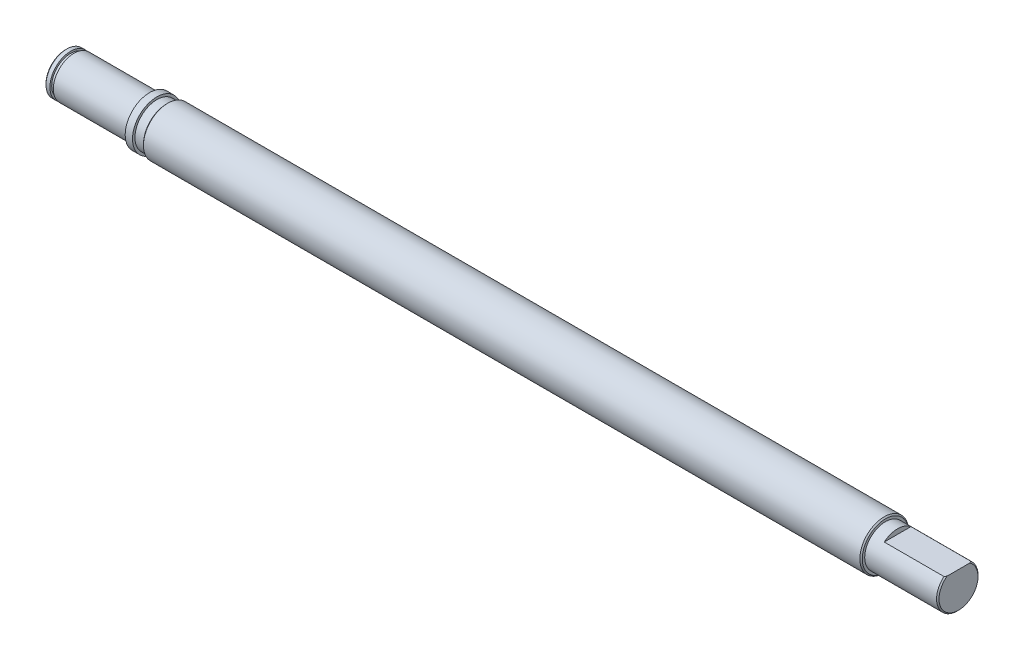
ISO-10303-21;
HEADER;
FILE_DESCRIPTION(('STEP AP214'),'2;1');
FILE_NAME('part.step','',(''),(''),'','','');
FILE_SCHEMA(('AUTOMOTIVE_DESIGN { 1 0 10303 214 1 1 1 1 }'));
ENDSEC;
DATA;
#1=APPLICATION_CONTEXT('core data for automotive mechanical design processes');
#2=APPLICATION_PROTOCOL_DEFINITION('international standard','automotive_design',2000,#1);
#3=PRODUCT_CONTEXT('',#1,'mechanical');
#4=PRODUCT('Part','Part','',(#3));
#5=PRODUCT_RELATED_PRODUCT_CATEGORY('part','',(#4));
#6=PRODUCT_DEFINITION_FORMATION('','',#4);
#7=PRODUCT_DEFINITION_CONTEXT('part definition',#1,'design');
#8=PRODUCT_DEFINITION('design','',#6,#7);
#9=PRODUCT_DEFINITION_SHAPE('','',#8);
#10=(LENGTH_UNIT() NAMED_UNIT(*) SI_UNIT(.MILLI.,.METRE.));
#11=(NAMED_UNIT(*) PLANE_ANGLE_UNIT() SI_UNIT($,.RADIAN.));
#12=(NAMED_UNIT(*) SI_UNIT($,.STERADIAN.) SOLID_ANGLE_UNIT());
#13=UNCERTAINTY_MEASURE_WITH_UNIT(LENGTH_MEASURE(1.E-05),#10,'distance_accuracy_value','');
#14=(GEOMETRIC_REPRESENTATION_CONTEXT(3) GLOBAL_UNCERTAINTY_ASSIGNED_CONTEXT((#13)) GLOBAL_UNIT_ASSIGNED_CONTEXT((#10,
#11,#12)) REPRESENTATION_CONTEXT('',''));
#15=CARTESIAN_POINT('',(0.,0.,0.));
#16=DIRECTION('',(0.,0.,1.));
#17=DIRECTION('',(1.,0.,0.));
#18=AXIS2_PLACEMENT_3D('',#15,#16,#17);
#19=CARTESIAN_POINT('',(-850.209513437538,-2.22044604925031E-13,-1.11022302462516E-13));
#20=DIRECTION('',(-1.,0.,0.));
#21=DIRECTION('',(0.,0.,1.));
#22=AXIS2_PLACEMENT_3D('',#19,#20,#21);
#23=CYLINDRICAL_SURFACE('',#22,10.);
#24=CARTESIAN_POINT('',(-331.998327754521,0.,0.));
#25=DIRECTION('',(-1.,0.,0.));
#26=DIRECTION('',(0.,0.,1.));
#27=AXIS2_PLACEMENT_3D('',#24,#25,#26);
#28=CIRCLE('',#27,10.);
#29=CARTESIAN_POINT('',(-331.998327754521,0.,10.));
#30=VERTEX_POINT('',#29);
#31=EDGE_CURVE('E135',#30,#30,#28,.T.);
#32=ORIENTED_EDGE('',*,*,#31,.F.);
#33=EDGE_LOOP('',(#32));
#34=FACE_BOUND('',#33,.T.);
#35=CARTESIAN_POINT('',(-328.998327754521,0.,0.));
#36=DIRECTION('',(-1.,0.,0.));
#37=DIRECTION('',(0.,0.,1.));
#38=AXIS2_PLACEMENT_3D('',#35,#36,#37);
#39=CIRCLE('',#38,10.);
#40=CARTESIAN_POINT('',(-328.998327754521,0.,10.));
#41=VERTEX_POINT('',#40);
#42=EDGE_CURVE('E105',#41,#41,#39,.T.);
#43=ORIENTED_EDGE('',*,*,#42,.T.);
#44=EDGE_LOOP('',(#43));
#45=FACE_BOUND('',#44,.T.);
#46=ADVANCED_FACE('F50',(#34,#45),#23,.T.);
#47=CARTESIAN_POINT('',(-331.998327754521,-10.,1.11022302462516E-13));
#48=DIRECTION('',(1.,0.,0.));
#49=DIRECTION('',(0.,0.,-1.));
#50=AXIS2_PLACEMENT_3D('',#47,#48,#49);
#51=PLANE('',#50);
#52=CARTESIAN_POINT('',(-331.998327754521,0.,0.));
#53=DIRECTION('',(-1.,0.,0.));
#54=DIRECTION('',(0.,0.,1.));
#55=AXIS2_PLACEMENT_3D('',#52,#53,#54);
#56=CIRCLE('',#55,8.5);
#57=CARTESIAN_POINT('',(-331.998327754521,0.,8.5));
#58=VERTEX_POINT('',#57);
#59=EDGE_CURVE('E132',#58,#58,#56,.T.);
#60=ORIENTED_EDGE('',*,*,#59,.F.);
#61=EDGE_LOOP('',(#60));
#62=FACE_BOUND('',#61,.T.);
#63=ORIENTED_EDGE('',*,*,#31,.T.);
#64=EDGE_LOOP('',(#63));
#65=FACE_BOUND('',#64,.T.);
#66=ADVANCED_FACE('F171',(#62,#65),#51,.F.);
#67=CARTESIAN_POINT('',(-850.209513437538,-2.22044604925031E-13,-1.11022302462516E-13));
#68=DIRECTION('',(-1.,0.,0.));
#69=DIRECTION('',(0.,0.,1.));
#70=AXIS2_PLACEMENT_3D('',#67,#68,#69);
#71=CYLINDRICAL_SURFACE('',#70,8.5);
#72=CARTESIAN_POINT('',(-362.998327754521,0.,0.));
#73=DIRECTION('',(-1.,0.,0.));
#74=DIRECTION('',(0.,0.,1.));
#75=AXIS2_PLACEMENT_3D('',#72,#73,#74);
#76=CIRCLE('',#75,8.5);
#77=CARTESIAN_POINT('',(-362.998327754521,0.,8.5));
#78=VERTEX_POINT('',#77);
#79=EDGE_CURVE('E129',#78,#78,#76,.T.);
#80=ORIENTED_EDGE('',*,*,#79,.F.);
#81=EDGE_LOOP('',(#80));
#82=FACE_BOUND('',#81,.T.);
#83=ORIENTED_EDGE('',*,*,#59,.T.);
#84=EDGE_LOOP('',(#83));
#85=FACE_BOUND('',#84,.T.);
#86=ADVANCED_FACE('F177',(#82,#85),#71,.T.);
#87=CARTESIAN_POINT('',(-362.998327754521,-7.75000000000003,0.));
#88=DIRECTION('',(1.,0.,0.));
#89=DIRECTION('',(0.,0.,-1.));
#90=AXIS2_PLACEMENT_3D('',#87,#88,#89);
#91=PLANE('',#90);
#92=CARTESIAN_POINT('',(-362.998327754521,0.,0.));
#93=DIRECTION('',(-1.,0.,0.));
#94=DIRECTION('',(0.,0.,1.));
#95=AXIS2_PLACEMENT_3D('',#92,#93,#94);
#96=CIRCLE('',#95,7.75);
#97=CARTESIAN_POINT('',(-362.998327754521,0.,7.75));
#98=VERTEX_POINT('',#97);
#99=EDGE_CURVE('E126',#98,#98,#96,.T.);
#100=ORIENTED_EDGE('',*,*,#99,.F.);
#101=EDGE_LOOP('',(#100));
#102=FACE_BOUND('',#101,.T.);
#103=ORIENTED_EDGE('',*,*,#79,.T.);
#104=EDGE_LOOP('',(#103));
#105=FACE_BOUND('',#104,.T.);
#106=ADVANCED_FACE('F217',(#102,#105),#91,.F.);
#107=CARTESIAN_POINT('',(-850.209513437538,-2.22044604925031E-13,-1.11022302462516E-13));
#108=DIRECTION('',(-1.,0.,0.));
#109=DIRECTION('',(0.,0.,1.));
#110=AXIS2_PLACEMENT_3D('',#107,#108,#109);
#111=CYLINDRICAL_SURFACE('',#110,7.75);
#112=CARTESIAN_POINT('',(-364.398327754521,0.,0.));
#113=DIRECTION('',(-1.,0.,0.));
#114=DIRECTION('',(0.,0.,1.));
#115=AXIS2_PLACEMENT_3D('',#112,#113,#114);
#116=CIRCLE('',#115,7.75);
#117=CARTESIAN_POINT('',(-364.398327754521,0.,7.75));
#118=VERTEX_POINT('',#117);
#119=EDGE_CURVE('E123',#118,#118,#116,.T.);
#120=ORIENTED_EDGE('',*,*,#119,.F.);
#121=EDGE_LOOP('',(#120));
#122=FACE_BOUND('',#121,.T.);
#123=ORIENTED_EDGE('',*,*,#99,.T.);
#124=EDGE_LOOP('',(#123));
#125=FACE_BOUND('',#124,.T.);
#126=ADVANCED_FACE('F213',(#122,#125),#111,.T.);
#127=CARTESIAN_POINT('',(-364.398327754521,-8.50000000000006,0.));
#128=DIRECTION('',(-1.,0.,0.));
#129=DIRECTION('',(0.,0.,1.));
#130=AXIS2_PLACEMENT_3D('',#127,#128,#129);
#131=PLANE('',#130);
#132=CARTESIAN_POINT('',(-364.398327754521,0.,0.));
#133=DIRECTION('',(-1.,0.,0.));
#134=DIRECTION('',(0.,0.,1.));
#135=AXIS2_PLACEMENT_3D('',#132,#133,#134);
#136=CIRCLE('',#135,8.5);
#137=CARTESIAN_POINT('',(-364.398327754521,0.,8.5));
#138=VERTEX_POINT('',#137);
#139=EDGE_CURVE('E120',#138,#138,#136,.T.);
#140=ORIENTED_EDGE('',*,*,#139,.F.);
#141=EDGE_LOOP('',(#140));
#142=FACE_BOUND('',#141,.T.);
#143=ORIENTED_EDGE('',*,*,#119,.T.);
#144=EDGE_LOOP('',(#143));
#145=FACE_BOUND('',#144,.T.);
#146=ADVANCED_FACE('F206',(#142,#145),#131,.F.);
#147=CARTESIAN_POINT('',(-850.209513437538,-2.22044604925031E-13,-1.11022302462516E-13));
#148=DIRECTION('',(-1.,0.,0.));
#149=DIRECTION('',(0.,0.,1.));
#150=AXIS2_PLACEMENT_3D('',#147,#148,#149);
#151=CYLINDRICAL_SURFACE('',#150,8.49999999999999);
#152=CARTESIAN_POINT('',(-365.998327754521,0.,0.));
#153=DIRECTION('',(1.,0.,0.));
#154=DIRECTION('',(0.,0.,-1.));
#155=AXIS2_PLACEMENT_3D('',#152,#153,#154);
#156=CIRCLE('',#155,8.49999999999999);
#157=CARTESIAN_POINT('',(-365.998327754521,0.,-8.49999999999999));
#158=VERTEX_POINT('',#157);
#159=EDGE_CURVE('E150',#158,#158,#156,.T.);
#160=ORIENTED_EDGE('',*,*,#159,.T.);
#161=EDGE_LOOP('',(#160));
#162=FACE_BOUND('',#161,.T.);
#163=ORIENTED_EDGE('',*,*,#139,.T.);
#164=EDGE_LOOP('',(#163));
#165=FACE_BOUND('',#164,.T.);
#166=ADVANCED_FACE('F199',(#162,#165),#151,.T.);
#167=CARTESIAN_POINT('',(-366.498327754521,-8.50000000000006,0.));
#168=DIRECTION('',(1.,0.,0.));
#169=DIRECTION('',(0.,0.,-1.));
#170=AXIS2_PLACEMENT_3D('',#167,#168,#169);
#171=PLANE('',#170);
#172=CARTESIAN_POINT('',(-366.498327754521,0.,0.));
#173=DIRECTION('',(1.,0.,0.));
#174=DIRECTION('',(0.,0.,-1.));
#175=AXIS2_PLACEMENT_3D('',#172,#173,#174);
#176=CIRCLE('',#175,8.00000000000006);
#177=CARTESIAN_POINT('',(-366.498327754521,0.,-8.00000000000006));
#178=VERTEX_POINT('',#177);
#179=EDGE_CURVE('E147',#178,#178,#176,.F.);
#180=ORIENTED_EDGE('',*,*,#179,.T.);
#181=EDGE_LOOP('',(#180));
#182=FACE_BOUND('',#181,.T.);
#183=ADVANCED_FACE('F197',(#182),#171,.F.);
#184=CARTESIAN_POINT('',(0.,0.,0.));
#185=DIRECTION('',(-1.,0.,0.));
#186=DIRECTION('',(0.,0.,1.));
#187=AXIS2_PLACEMENT_3D('',#184,#185,#186);
#188=PLANE('',#187);
#189=CARTESIAN_POINT('',(0.,0.,0.));
#190=DIRECTION('',(-1.,0.,0.));
#191=DIRECTION('',(0.,0.,1.));
#192=AXIS2_PLACEMENT_3D('',#189,#190,#191);
#193=CIRCLE('',#192,8.00000000000001);
#194=CARTESIAN_POINT('',(0.,6.49999999999984,4.66368952654433));
#195=VERTEX_POINT('',#194);
#196=CARTESIAN_POINT('',(0.,6.50000000000006,-4.66368952654456));
#197=VERTEX_POINT('',#196);
#198=EDGE_CURVE('E156',#195,#197,#193,.F.);
#199=ORIENTED_EDGE('',*,*,#198,.T.);
#200=DIRECTION('',(0.,0.,-1.));
#201=VECTOR('',#200,1.);
#202=CARTESIAN_POINT('',(0.,6.50000000000006,5.47722557505159));
#203=LINE('',#202,#201);
#204=EDGE_CURVE('E70',#195,#197,#203,.T.);
#205=ORIENTED_EDGE('',*,*,#204,.F.);
#206=EDGE_LOOP('',(#199,#205));
#207=FACE_BOUND('',#206,.T.);
#208=ADVANCED_FACE('F160',(#207),#188,.F.);
#209=CARTESIAN_POINT('',(-850.209513437538,-2.22044604925031E-13,-1.11022302462516E-13));
#210=DIRECTION('',(-1.,0.,0.));
#211=DIRECTION('',(0.,0.,1.));
#212=AXIS2_PLACEMENT_3D('',#209,#210,#211);
#213=CYLINDRICAL_SURFACE('',#212,8.5);
#214=CARTESIAN_POINT('',(-0.500000000000056,0.,0.));
#215=DIRECTION('',(-1.,0.,0.));
#216=DIRECTION('',(0.,0.,1.));
#217=AXIS2_PLACEMENT_3D('',#214,#215,#216);
#218=CIRCLE('',#217,8.5);
#219=CARTESIAN_POINT('',(-0.499999999999834,6.49999999999984,-5.4772255750517));
#220=VERTEX_POINT('',#219);
#221=CARTESIAN_POINT('',(-0.500000000000056,6.50000000000006,5.47722557505159));
#222=VERTEX_POINT('',#221);
#223=EDGE_CURVE('E103',#220,#222,#218,.T.);
#224=ORIENTED_EDGE('',*,*,#223,.T.);
#225=DIRECTION('',(1.,0.,0.));
#226=VECTOR('',#225,1.);
#227=CARTESIAN_POINT('',(-24.9999999999999,6.50000000000006,5.47722557505154));
#228=LINE('',#227,#226);
#229=CARTESIAN_POINT('',(-24.9999999999999,6.50000000000006,5.47722557505154));
#230=VERTEX_POINT('',#229);
#231=EDGE_CURVE('E95',#230,#222,#228,.T.);
#232=ORIENTED_EDGE('',*,*,#231,.F.);
#233=CARTESIAN_POINT('',(-25.,0.,0.));
#234=DIRECTION('',(1.,0.,0.));
#235=DIRECTION('',(0.,0.,-1.));
#236=AXIS2_PLACEMENT_3D('',#233,#234,#235);
#237=CIRCLE('',#236,8.5);
#238=CARTESIAN_POINT('',(-25.,6.49999999999984,-5.4772255750517));
#239=VERTEX_POINT('',#238);
#240=EDGE_CURVE('E87',#239,#230,#237,.T.);
#241=ORIENTED_EDGE('',*,*,#240,.F.);
#242=DIRECTION('',(1.,0.,0.));
#243=VECTOR('',#242,1.);
#244=CARTESIAN_POINT('',(-25.,6.49999999999984,-5.4772255750517));
#245=LINE('',#244,#243);
#246=EDGE_CURVE('E97',#239,#220,#245,.T.);
#247=ORIENTED_EDGE('',*,*,#246,.T.);
#248=EDGE_LOOP('',(#224,#232,#241,#247));
#249=FACE_BOUND('',#248,.T.);
#250=CARTESIAN_POINT('',(-30.,0.,0.));
#251=DIRECTION('',(-1.,0.,0.));
#252=DIRECTION('',(0.,0.,1.));
#253=AXIS2_PLACEMENT_3D('',#250,#251,#252);
#254=CIRCLE('',#253,8.5);
#255=CARTESIAN_POINT('',(-30.,0.,8.5));
#256=VERTEX_POINT('',#255);
#257=EDGE_CURVE('E117',#256,#256,#254,.T.);
#258=ORIENTED_EDGE('',*,*,#257,.F.);
#259=EDGE_LOOP('',(#258));
#260=FACE_BOUND('',#259,.T.);
#261=ADVANCED_FACE('F100',(#249,#260),#213,.T.);
#262=CARTESIAN_POINT('',(-29.9999999999999,-8.49999999999995,0.));
#263=DIRECTION('',(-1.,0.,0.));
#264=DIRECTION('',(0.,0.,1.));
#265=AXIS2_PLACEMENT_3D('',#262,#263,#264);
#266=PLANE('',#265);
#267=CARTESIAN_POINT('',(-30.,0.,0.));
#268=DIRECTION('',(-1.,0.,0.));
#269=DIRECTION('',(0.,0.,1.));
#270=AXIS2_PLACEMENT_3D('',#267,#268,#269);
#271=CIRCLE('',#270,9.49999999999998);
#272=CARTESIAN_POINT('',(-30.,0.,9.49999999999998));
#273=VERTEX_POINT('',#272);
#274=EDGE_CURVE('E153',#273,#273,#271,.F.);
#275=ORIENTED_EDGE('',*,*,#274,.T.);
#276=EDGE_LOOP('',(#275));
#277=FACE_BOUND('',#276,.T.);
#278=ORIENTED_EDGE('',*,*,#257,.T.);
#279=EDGE_LOOP('',(#278));
#280=FACE_BOUND('',#279,.T.);
#281=ADVANCED_FACE('F261',(#277,#280),#266,.F.);
#282=CARTESIAN_POINT('',(-850.209513437538,-2.22044604925031E-13,-1.11022302462516E-13));
#283=DIRECTION('',(-1.,0.,0.));
#284=DIRECTION('',(0.,0.,1.));
#285=AXIS2_PLACEMENT_3D('',#282,#283,#284);
#286=CYLINDRICAL_SURFACE('',#285,9.99999999999998);
#287=CARTESIAN_POINT('',(-324.498327754521,0.,0.));
#288=DIRECTION('',(1.,0.,0.));
#289=DIRECTION('',(0.,0.,-1.));
#290=AXIS2_PLACEMENT_3D('',#287,#288,#289);
#291=CIRCLE('',#290,9.99999999999998);
#292=CARTESIAN_POINT('',(-324.498327754521,0.,-9.99999999999998));
#293=VERTEX_POINT('',#292);
#294=EDGE_CURVE('E144',#293,#293,#291,.T.);
#295=ORIENTED_EDGE('',*,*,#294,.T.);
#296=EDGE_LOOP('',(#295));
#297=FACE_BOUND('',#296,.T.);
#298=CARTESIAN_POINT('',(-30.5000000000001,0.,0.));
#299=DIRECTION('',(-1.,0.,0.));
#300=DIRECTION('',(0.,0.,1.));
#301=AXIS2_PLACEMENT_3D('',#298,#299,#300);
#302=CIRCLE('',#301,9.99999999999998);
#303=CARTESIAN_POINT('',(-30.5000000000001,0.,9.99999999999998));
#304=VERTEX_POINT('',#303);
#305=EDGE_CURVE('E141',#304,#304,#302,.T.);
#306=ORIENTED_EDGE('',*,*,#305,.T.);
#307=EDGE_LOOP('',(#306));
#308=FACE_BOUND('',#307,.T.);
#309=ADVANCED_FACE('F268',(#297,#308),#286,.T.);
#310=CARTESIAN_POINT('',(-324.998327754521,-10.0000000000002,1.11022302462516E-13));
#311=DIRECTION('',(1.,0.,0.));
#312=DIRECTION('',(0.,0.,-1.));
#313=AXIS2_PLACEMENT_3D('',#310,#311,#312);
#314=PLANE('',#313);
#315=CARTESIAN_POINT('',(-324.998327754521,0.,0.));
#316=DIRECTION('',(1.,0.,0.));
#317=DIRECTION('',(0.,0.,-1.));
#318=AXIS2_PLACEMENT_3D('',#315,#316,#317);
#319=CIRCLE('',#318,9.4999999999999);
#320=CARTESIAN_POINT('',(-324.998327754521,0.,-9.4999999999999));
#321=VERTEX_POINT('',#320);
#322=EDGE_CURVE('E138',#321,#321,#319,.F.);
#323=ORIENTED_EDGE('',*,*,#322,.T.);
#324=EDGE_LOOP('',(#323));
#325=FACE_BOUND('',#324,.T.);
#326=CARTESIAN_POINT('',(-324.998327754521,0.,0.));
#327=DIRECTION('',(-1.,0.,0.));
#328=DIRECTION('',(0.,0.,1.));
#329=AXIS2_PLACEMENT_3D('',#326,#327,#328);
#330=CIRCLE('',#329,9.);
#331=CARTESIAN_POINT('',(-324.998327754521,0.,9.));
#332=VERTEX_POINT('',#331);
#333=EDGE_CURVE('E114',#332,#332,#330,.T.);
#334=ORIENTED_EDGE('',*,*,#333,.F.);
#335=EDGE_LOOP('',(#334));
#336=FACE_BOUND('',#335,.T.);
#337=ADVANCED_FACE('F279',(#325,#336),#314,.F.);
#338=CARTESIAN_POINT('',(-850.209513437538,-2.22044604925031E-13,-1.11022302462516E-13));
#339=DIRECTION('',(-1.,0.,0.));
#340=DIRECTION('',(0.,0.,1.));
#341=AXIS2_PLACEMENT_3D('',#338,#339,#340);
#342=CYLINDRICAL_SURFACE('',#341,9.);
#343=CARTESIAN_POINT('',(-328.998327754521,0.,0.));
#344=DIRECTION('',(-1.,0.,0.));
#345=DIRECTION('',(0.,0.,1.));
#346=AXIS2_PLACEMENT_3D('',#343,#344,#345);
#347=CIRCLE('',#346,9.);
#348=CARTESIAN_POINT('',(-328.998327754521,0.,9.));
#349=VERTEX_POINT('',#348);
#350=EDGE_CURVE('E111',#349,#349,#347,.T.);
#351=ORIENTED_EDGE('',*,*,#350,.F.);
#352=EDGE_LOOP('',(#351));
#353=FACE_BOUND('',#352,.T.);
#354=ORIENTED_EDGE('',*,*,#333,.T.);
#355=EDGE_LOOP('',(#354));
#356=FACE_BOUND('',#355,.T.);
#357=ADVANCED_FACE('F288',(#353,#356),#342,.T.);
#358=CARTESIAN_POINT('',(-328.998327754521,-9.00000000000023,1.11022302462516E-13));
#359=DIRECTION('',(-1.,0.,0.));
#360=DIRECTION('',(0.,0.,1.));
#361=AXIS2_PLACEMENT_3D('',#358,#359,#360);
#362=PLANE('',#361);
#363=ORIENTED_EDGE('',*,*,#42,.F.);
#364=EDGE_LOOP('',(#363));
#365=FACE_BOUND('',#364,.T.);
#366=ORIENTED_EDGE('',*,*,#350,.T.);
#367=EDGE_LOOP('',(#366));
#368=FACE_BOUND('',#367,.T.);
#369=ADVANCED_FACE('F187',(#365,#368),#362,.F.);
#370=CARTESIAN_POINT('',(-324.998327754521,0.,0.));
#371=DIRECTION('',(1.,0.,0.));
#372=DIRECTION('',(0.,0.,-1.));
#373=AXIS2_PLACEMENT_3D('',#370,#371,#372);
#374=CONICAL_SURFACE('',#373,9.4999999999999,0.785398163397476);
#375=ORIENTED_EDGE('',*,*,#294,.F.);
#376=EDGE_LOOP('',(#375));
#377=FACE_BOUND('',#376,.T.);
#378=ORIENTED_EDGE('',*,*,#322,.F.);
#379=EDGE_LOOP('',(#378));
#380=FACE_BOUND('',#379,.T.);
#381=ADVANCED_FACE('F184',(#377,#380),#374,.T.);
#382=CARTESIAN_POINT('',(-366.498327754521,0.,0.));
#383=DIRECTION('',(1.,0.,0.));
#384=DIRECTION('',(0.,0.,-1.));
#385=AXIS2_PLACEMENT_3D('',#382,#383,#384);
#386=CONICAL_SURFACE('',#385,8.00000000000006,0.785398163397492);
#387=ORIENTED_EDGE('',*,*,#159,.F.);
#388=EDGE_LOOP('',(#387));
#389=FACE_BOUND('',#388,.T.);
#390=ORIENTED_EDGE('',*,*,#179,.F.);
#391=EDGE_LOOP('',(#390));
#392=FACE_BOUND('',#391,.T.);
#393=ADVANCED_FACE('F168',(#389,#392),#386,.T.);
#394=CARTESIAN_POINT('',(-30.5000000000001,0.,0.));
#395=DIRECTION('',(-1.,0.,0.));
#396=DIRECTION('',(0.,0.,1.));
#397=AXIS2_PLACEMENT_3D('',#394,#395,#396);
#398=CONICAL_SURFACE('',#397,9.99999999999998,0.785398163397365);
#399=ORIENTED_EDGE('',*,*,#274,.F.);
#400=EDGE_LOOP('',(#399));
#401=FACE_BOUND('',#400,.T.);
#402=ORIENTED_EDGE('',*,*,#305,.F.);
#403=EDGE_LOOP('',(#402));
#404=FACE_BOUND('',#403,.T.);
#405=ADVANCED_FACE('F163',(#401,#404),#398,.T.);
#406=CARTESIAN_POINT('',(-0.500000000000056,0.,0.));
#407=DIRECTION('',(-1.,0.,0.));
#408=DIRECTION('',(0.,0.,1.));
#409=AXIS2_PLACEMENT_3D('',#406,#407,#408);
#410=CONICAL_SURFACE('',#409,8.5,0.785398163397384);
#411=CARTESIAN_POINT('',(-5.69743712209875,6.49999999999962,12.05693923489));
#412=CARTESIAN_POINT('',(-5.54206813330457,6.4999999999999,11.8804262766136));
#413=CARTESIAN_POINT('',(-5.38712774277621,6.50000000000002,11.7035363286301));
#414=CARTESIAN_POINT('',(-5.07822440750252,6.50000000000011,11.3489009490012));
#415=CARTESIAN_POINT('',(-4.92426147619071,6.50000000000008,11.1711555056572));
#416=CARTESIAN_POINT('',(-4.46389755554307,6.50000000000003,10.6363421646338));
#417=CARTESIAN_POINT('',(-4.15915135114167,6.50000000000005,10.2778444487883));
#418=CARTESIAN_POINT('',(-3.54981172574118,6.50000000000007,9.54928203223429));
#419=CARTESIAN_POINT('',(-3.24532697979096,6.50000000000006,9.17912627395745));
#420=CARTESIAN_POINT('',(-2.64450231719234,6.50000000000006,8.43236504983786));
#421=CARTESIAN_POINT('',(-2.3481604534497,6.50000000000006,8.05576116142767));
#422=CARTESIAN_POINT('',(-1.91201191817774,6.50000000000006,7.48418596016677));
#423=CARTESIAN_POINT('',(-1.76795658061665,6.50000000000006,7.29245653386725));
#424=CARTESIAN_POINT('',(-1.48326927815143,6.50000000000006,6.90647642122973));
#425=CARTESIAN_POINT('',(-1.34263719681773,6.50000000000006,6.71222582098577));
#426=CARTESIAN_POINT('',(-1.06538577498836,6.50000000000006,6.32062919115317));
#427=CARTESIAN_POINT('',(-0.928769905188368,6.50000000000006,6.12328069796961));
#428=CARTESIAN_POINT('',(-0.660596307651594,6.50000000000006,5.72517083670715));
#429=CARTESIAN_POINT('',(-0.529038470632277,6.50000000000006,5.52440954249964));
#430=CARTESIAN_POINT('',(-0.272824729080938,6.50000000000006,5.11996021658769));
#431=CARTESIAN_POINT('',(-0.148136775392979,6.50000000000006,4.91629257637214));
#432=CARTESIAN_POINT('',(0.0935632434968199,6.50000000000006,4.50439377311447));
#433=CARTESIAN_POINT('',(0.210574379211626,6.50000000000007,4.29616206152469));
#434=CARTESIAN_POINT('',(0.43479322648419,6.50000000000005,3.87480703739281));
#435=CARTESIAN_POINT('',(0.542013927986298,6.50000000000003,3.66169068995257));
#436=CARTESIAN_POINT('',(0.744294588269613,6.50000000000009,3.2298053081311));
#437=CARTESIAN_POINT('',(0.839359043236476,6.50000000000017,3.01103839989748));
#438=CARTESIAN_POINT('',(1.01642239008404,6.50000000000017,2.56201662671686));
#439=CARTESIAN_POINT('',(1.09804603876408,6.50000000000009,2.33161170777875));
#440=CARTESIAN_POINT('',(1.2414785604438,6.50000000000003,1.86464712634739));
#441=CARTESIAN_POINT('',(1.30329050696055,6.50000000000004,1.62808842469248));
#442=CARTESIAN_POINT('',(1.40279385439402,6.50000000000008,1.15187526443406));
#443=CARTESIAN_POINT('',(1.44067922035136,6.50000000000009,0.912262197761403));
#444=CARTESIAN_POINT('',(1.49017659855713,6.50000000000003,0.430321006665629));
#445=CARTESIAN_POINT('',(1.50179402442145,6.49999999999995,0.187993452024763));
#446=CARTESIAN_POINT('',(1.49774314845286,6.49999999999995,-0.297699190707079));
#447=CARTESIAN_POINT('',(1.48193159854594,6.50000000000003,-0.541063064377044));
#448=CARTESIAN_POINT('',(1.42412200393656,6.50000000000009,-1.02464198688366));
#449=CARTESIAN_POINT('',(1.38211752500991,6.50000000000007,-1.26485624721811));
#450=CARTESIAN_POINT('',(1.27466305818927,6.50000000000005,-1.74205410903041));
#451=CARTESIAN_POINT('',(1.20901373997068,6.50000000000006,-1.97899189925944));
#452=CARTESIAN_POINT('',(1.05835016553715,6.50000000000006,-2.44653565459068));
#453=CARTESIAN_POINT('',(0.973334359202271,6.50000000000006,-2.67714111118781));
#454=CARTESIAN_POINT('',(0.774536418750778,6.50000000000006,-3.16444104748807));
#455=CARTESIAN_POINT('',(0.658379810462579,6.50000000000006,-3.42015616125822));
#456=CARTESIAN_POINT('',(0.410548627615234,6.50000000000006,-3.9240182661893));
#457=CARTESIAN_POINT('',(0.278865461401322,6.50000000000006,-4.17216097064083));
#458=CARTESIAN_POINT('',(0.00342023423977774,6.50000000000006,-4.66223448450475));
#459=CARTESIAN_POINT('',(-0.140365049029101,6.50000000000006,-4.90415213204964));
#460=CARTESIAN_POINT('',(-0.437027553989442,6.50000000000006,-5.38224400693766));
#461=CARTESIAN_POINT('',(-0.589903033994002,6.50000000000006,-5.61841932237528));
#462=CARTESIAN_POINT('',(-0.903632329156382,6.50000000000006,-6.08729638710446));
#463=CARTESIAN_POINT('',(-1.06452588188109,6.50000000000006,-6.31997142123451));
#464=CARTESIAN_POINT('',(-1.39199090048817,6.50000000000006,-6.78128850817388));
#465=CARTESIAN_POINT('',(-1.55856257072682,6.50000000000005,-7.00993041538001));
#466=CARTESIAN_POINT('',(-1.89605604657339,6.50000000000008,-7.46356901027817));
#467=CARTESIAN_POINT('',(-2.06697270753766,6.50000000000011,-7.68856953589709));
#468=CARTESIAN_POINT('',(-2.41248159395909,6.50000000000001,-8.13571713012345));
#469=CARTESIAN_POINT('',(-2.58707374977386,6.49999999999986,-8.35786425266828));
#470=CARTESIAN_POINT('',(-3.00119758286103,6.49999999999981,-8.87743929877966));
#471=CARTESIAN_POINT('',(-3.24197713104982,6.49999999999999,-9.17387168700063));
#472=CARTESIAN_POINT('',(-3.72788663256499,6.50000000000013,-9.76325167674597));
#473=CARTESIAN_POINT('',(-3.97301755852443,6.50000000000008,-10.0561984740837));
#474=CARTESIAN_POINT('',(-4.46323699440563,6.50000000000004,-10.6351170826198));
#475=CARTESIAN_POINT('',(-4.70827807530826,6.50000000000005,-10.9211291301552));
#476=CARTESIAN_POINT('',(-5.20100617917238,6.50000000000007,-11.4907206549365));
#477=CARTESIAN_POINT('',(-5.44869240939299,6.50000000000008,-11.7743008174831));
#478=CARTESIAN_POINT('',(-5.6974371220988,6.50000000000006,-12.05693923489));
#479=B_SPLINE_CURVE_WITH_KNOTS('',3,(#411,#412,#413,#414,#415,#416,#417,#418,#419,#420,#421,
#422,#423,#424,#425,#426,#427,#428,#429,#430,#431,#432,#433,#434,#435,#436,#437,#438,#439,#440,
#441,#442,#443,#444,#445,#446,#447,#448,#449,#450,#451,#452,#453,#454,#455,#456,#457,#458,#459,
#460,#461,#462,#463,#464,#465,#466,#467,#468,#469,#470,#471,#472,#473,#474,#475,#476,#477,#478),
.UNSPECIFIED.,.F.,.F.,(4,2,2,2,2,2,2,2,2,2,2,2,2,2,2,2,2,2,2,2,2,2,2,2,2,2,2,2,2,2,2,2,2,4),(0.,
0.705453688722365,1.41091705182018,2.82243271301791,4.26025206426242,5.69772456394238,
6.41714561763795,7.13654216856462,7.85654314184083,8.57652855021216,9.29280688436847,
10.0091717840032,10.7245719637449,11.4397067709932,12.1722846422785,12.9047488089649,
13.6311962195765,14.3574939014378,15.0875961078194,15.817877732579,16.5544656716539,
17.291112588954,18.1329972867713,18.9753500491593,19.8193577251792,20.663204206692,
21.5117564523939,22.3603392699264,23.2079602636698,24.0555652113267,25.2012076312076,
26.34710943614,27.4769724494296,28.6065058536034),.UNSPECIFIED.);
#480=EDGE_CURVE('E13',#222,#195,#479,.T.);
#481=ORIENTED_EDGE('',*,*,#480,.F.);
#482=ORIENTED_EDGE('',*,*,#223,.F.);
#483=EDGE_CURVE('E55',#197,#220,#479,.T.);
#484=ORIENTED_EDGE('',*,*,#483,.F.);
#485=ORIENTED_EDGE('',*,*,#198,.F.);
#486=EDGE_LOOP('',(#481,#482,#484,#485));
#487=FACE_BOUND('',#486,.T.);
#488=ADVANCED_FACE('F52',(#487),#410,.T.);
#489=CARTESIAN_POINT('',(-24.9999999999999,6.50000000000006,5.47722557505154));
#490=DIRECTION('',(0.,-1.,0.));
#491=DIRECTION('',(0.,0.,-1.));
#492=AXIS2_PLACEMENT_3D('',#489,#490,#491);
#493=PLANE('',#492);
#494=ORIENTED_EDGE('',*,*,#480,.T.);
#495=ORIENTED_EDGE('',*,*,#204,.T.);
#496=ORIENTED_EDGE('',*,*,#483,.T.);
#497=ORIENTED_EDGE('',*,*,#246,.F.);
#498=DIRECTION('',(0.,0.,-1.));
#499=VECTOR('',#498,1.);
#500=CARTESIAN_POINT('',(-24.9999999999999,6.50000000000006,5.47722557505154));
#501=LINE('',#500,#499);
#502=EDGE_CURVE('E90',#230,#239,#501,.T.);
#503=ORIENTED_EDGE('',*,*,#502,.F.);
#504=ORIENTED_EDGE('',*,*,#231,.T.);
#505=EDGE_LOOP('',(#494,#495,#496,#497,#503,#504));
#506=FACE_BOUND('',#505,.T.);
#507=ADVANCED_FACE('F94',(#506),#493,.F.);
#508=CARTESIAN_POINT('',(-25.,0.,0.));
#509=DIRECTION('',(1.,0.,0.));
#510=DIRECTION('',(0.,0.,-1.));
#511=AXIS2_PLACEMENT_3D('',#508,#509,#510);
#512=PLANE('',#511);
#513=ORIENTED_EDGE('',*,*,#240,.T.);
#514=ORIENTED_EDGE('',*,*,#502,.T.);
#515=EDGE_LOOP('',(#513,#514));
#516=FACE_BOUND('',#515,.T.);
#517=ADVANCED_FACE('F89',(#516),#512,.T.);
#518=CLOSED_SHELL('',(#46,#66,#86,#106,#126,#146,#166,#183,#208,#261,#281,#309,#337,#357,#369,
#381,#393,#405,#488,#507,#517));
#519=MANIFOLD_SOLID_BREP('B2',#518);
#520=ADVANCED_BREP_SHAPE_REPRESENTATION('',(#18,#519),#14);
#521=SHAPE_DEFINITION_REPRESENTATION(#9,#520);
ENDSEC;
END-ISO-10303-21;
